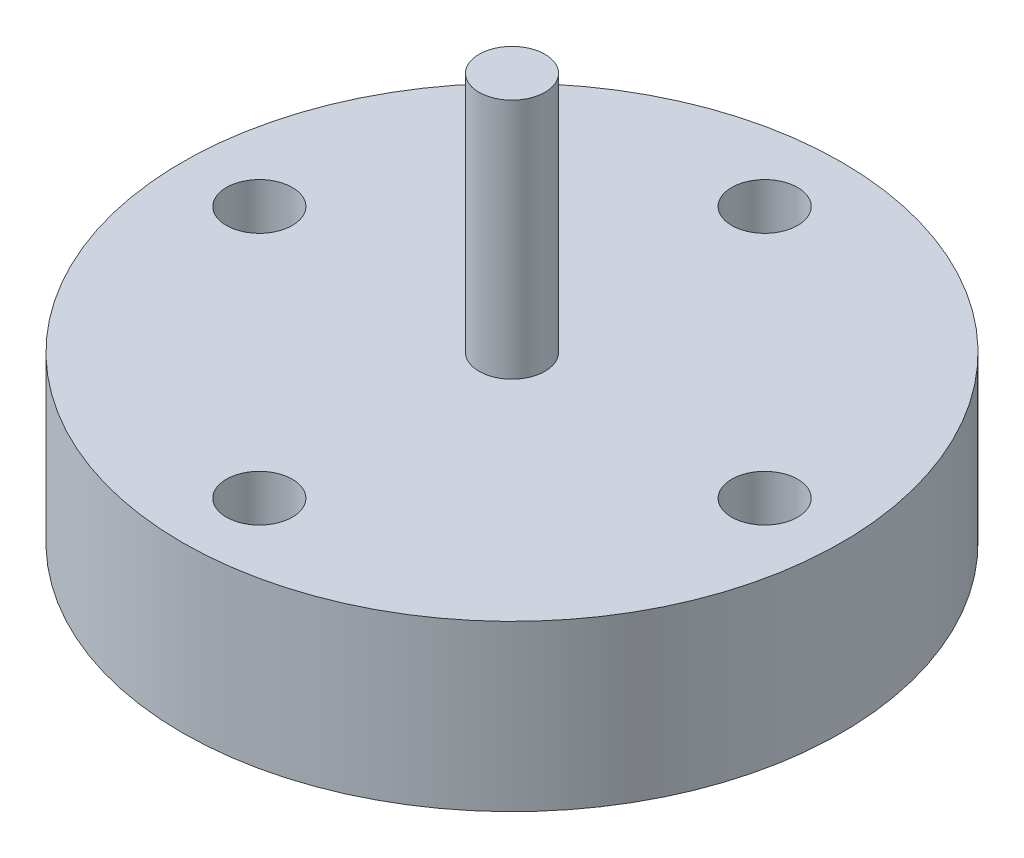
ISO-10303-21;
HEADER;
FILE_DESCRIPTION(('STEP AP214'),'2;1');
FILE_NAME('part.step','',(''),(''),'','','');
FILE_SCHEMA(('AUTOMOTIVE_DESIGN { 1 0 10303 214 1 1 1 1 }'));
ENDSEC;
DATA;
#1=APPLICATION_CONTEXT('core data for automotive mechanical design processes');
#2=APPLICATION_PROTOCOL_DEFINITION('international standard','automotive_design',2000,#1);
#3=PRODUCT_CONTEXT('',#1,'mechanical');
#4=PRODUCT('Part','Part','',(#3));
#5=PRODUCT_RELATED_PRODUCT_CATEGORY('part','',(#4));
#6=PRODUCT_DEFINITION_FORMATION('','',#4);
#7=PRODUCT_DEFINITION_CONTEXT('part definition',#1,'design');
#8=PRODUCT_DEFINITION('design','',#6,#7);
#9=PRODUCT_DEFINITION_SHAPE('','',#8);
#10=(LENGTH_UNIT() NAMED_UNIT(*) SI_UNIT(.MILLI.,.METRE.));
#11=(NAMED_UNIT(*) PLANE_ANGLE_UNIT() SI_UNIT($,.RADIAN.));
#12=(NAMED_UNIT(*) SI_UNIT($,.STERADIAN.) SOLID_ANGLE_UNIT());
#13=UNCERTAINTY_MEASURE_WITH_UNIT(LENGTH_MEASURE(1.E-05),#10,'distance_accuracy_value','');
#14=(GEOMETRIC_REPRESENTATION_CONTEXT(3) GLOBAL_UNCERTAINTY_ASSIGNED_CONTEXT((#13)) GLOBAL_UNIT_ASSIGNED_CONTEXT((#10,
#11,#12)) REPRESENTATION_CONTEXT('',''));
#15=CARTESIAN_POINT('',(0.,0.,0.));
#16=DIRECTION('',(0.,0.,1.));
#17=DIRECTION('',(1.,0.,0.));
#18=AXIS2_PLACEMENT_3D('',#15,#16,#17);
#19=CARTESIAN_POINT('',(0.,7.5,0.));
#20=DIRECTION('',(0.,-1.,0.));
#21=DIRECTION('',(0.,0.,-1.));
#22=AXIS2_PLACEMENT_3D('',#19,#20,#21);
#23=CYLINDRICAL_SURFACE('',#22,15.);
#24=CARTESIAN_POINT('',(0.,7.5,0.));
#25=DIRECTION('',(0.,1.,0.));
#26=DIRECTION('',(0.,0.,1.));
#27=AXIS2_PLACEMENT_3D('',#24,#25,#26);
#28=CIRCLE('',#27,15.);
#29=CARTESIAN_POINT('',(0.,7.5,15.));
#30=VERTEX_POINT('',#29);
#31=EDGE_CURVE('E10',#30,#30,#28,.T.);
#32=ORIENTED_EDGE('',*,*,#31,.F.);
#33=EDGE_LOOP('',(#32));
#34=FACE_BOUND('',#33,.T.);
#35=CARTESIAN_POINT('',(0.,0.,0.));
#36=DIRECTION('',(0.,1.,0.));
#37=DIRECTION('',(0.,0.,1.));
#38=AXIS2_PLACEMENT_3D('',#35,#36,#37);
#39=CIRCLE('',#38,15.);
#40=CARTESIAN_POINT('',(0.,0.,15.));
#41=VERTEX_POINT('',#40);
#42=EDGE_CURVE('E39',#41,#41,#39,.T.);
#43=ORIENTED_EDGE('',*,*,#42,.T.);
#44=EDGE_LOOP('',(#43));
#45=FACE_BOUND('',#44,.T.);
#46=ADVANCED_FACE('F36',(#34,#45),#23,.T.);
#47=CARTESIAN_POINT('',(0.,7.5,0.));
#48=DIRECTION('',(0.,1.,0.));
#49=DIRECTION('',(0.,0.,1.));
#50=AXIS2_PLACEMENT_3D('',#47,#48,#49);
#51=PLANE('',#50);
#52=CARTESIAN_POINT('',(0.,7.5,-11.5));
#53=DIRECTION('',(0.,1.,0.));
#54=DIRECTION('',(0.,0.,1.));
#55=AXIS2_PLACEMENT_3D('',#52,#53,#54);
#56=CIRCLE('',#55,1.5);
#57=CARTESIAN_POINT('',(0.,7.5,-10.));
#58=VERTEX_POINT('',#57);
#59=EDGE_CURVE('E90',#58,#58,#56,.T.);
#60=ORIENTED_EDGE('',*,*,#59,.F.);
#61=EDGE_LOOP('',(#60));
#62=FACE_BOUND('',#61,.T.);
#63=CARTESIAN_POINT('',(11.5,7.5,0.));
#64=DIRECTION('',(0.,1.,0.));
#65=DIRECTION('',(0.,0.,1.));
#66=AXIS2_PLACEMENT_3D('',#63,#64,#65);
#67=CIRCLE('',#66,1.5);
#68=CARTESIAN_POINT('',(11.5,7.5,1.5));
#69=VERTEX_POINT('',#68);
#70=EDGE_CURVE('E82',#69,#69,#67,.T.);
#71=ORIENTED_EDGE('',*,*,#70,.F.);
#72=EDGE_LOOP('',(#71));
#73=FACE_BOUND('',#72,.T.);
#74=CARTESIAN_POINT('',(0.,7.5,11.5));
#75=DIRECTION('',(0.,1.,0.));
#76=DIRECTION('',(0.,0.,1.));
#77=AXIS2_PLACEMENT_3D('',#74,#75,#76);
#78=CIRCLE('',#77,1.5);
#79=CARTESIAN_POINT('',(0.,7.5,13.));
#80=VERTEX_POINT('',#79);
#81=EDGE_CURVE('E74',#80,#80,#78,.T.);
#82=ORIENTED_EDGE('',*,*,#81,.F.);
#83=EDGE_LOOP('',(#82));
#84=FACE_BOUND('',#83,.T.);
#85=CARTESIAN_POINT('',(-11.5,7.5,0.));
#86=DIRECTION('',(0.,1.,0.));
#87=DIRECTION('',(0.,0.,1.));
#88=AXIS2_PLACEMENT_3D('',#85,#86,#87);
#89=CIRCLE('',#88,1.5);
#90=CARTESIAN_POINT('',(-11.5,7.5,1.5));
#91=VERTEX_POINT('',#90);
#92=EDGE_CURVE('E66',#91,#91,#89,.T.);
#93=ORIENTED_EDGE('',*,*,#92,.F.);
#94=EDGE_LOOP('',(#93));
#95=FACE_BOUND('',#94,.T.);
#96=CARTESIAN_POINT('',(0.,7.5,0.));
#97=DIRECTION('',(0.,1.,0.));
#98=DIRECTION('',(0.,0.,1.));
#99=AXIS2_PLACEMENT_3D('',#96,#97,#98);
#100=CIRCLE('',#99,1.5);
#101=CARTESIAN_POINT('',(0.,7.5,1.5));
#102=VERTEX_POINT('',#101);
#103=EDGE_CURVE('E50',#102,#102,#100,.T.);
#104=ORIENTED_EDGE('',*,*,#103,.F.);
#105=EDGE_LOOP('',(#104));
#106=FACE_BOUND('',#105,.T.);
#107=ORIENTED_EDGE('',*,*,#31,.T.);
#108=EDGE_LOOP('',(#107));
#109=FACE_BOUND('',#108,.T.);
#110=ADVANCED_FACE('F108',(#62,#73,#84,#95,#106,#109),#51,.T.);
#111=CARTESIAN_POINT('',(0.,0.,0.));
#112=DIRECTION('',(0.,1.,0.));
#113=DIRECTION('',(0.,0.,1.));
#114=AXIS2_PLACEMENT_3D('',#111,#112,#113);
#115=PLANE('',#114);
#116=CARTESIAN_POINT('',(0.,0.,-11.5));
#117=DIRECTION('',(0.,1.,0.));
#118=DIRECTION('',(0.,0.,1.));
#119=AXIS2_PLACEMENT_3D('',#116,#117,#118);
#120=CIRCLE('',#119,1.5);
#121=CARTESIAN_POINT('',(0.,0.,-10.));
#122=VERTEX_POINT('',#121);
#123=EDGE_CURVE('E62',#122,#122,#120,.T.);
#124=ORIENTED_EDGE('',*,*,#123,.T.);
#125=EDGE_LOOP('',(#124));
#126=FACE_BOUND('',#125,.T.);
#127=CARTESIAN_POINT('',(11.5,0.,0.));
#128=DIRECTION('',(0.,1.,0.));
#129=DIRECTION('',(0.,0.,1.));
#130=AXIS2_PLACEMENT_3D('',#127,#128,#129);
#131=CIRCLE('',#130,1.5);
#132=CARTESIAN_POINT('',(11.5,0.,1.5));
#133=VERTEX_POINT('',#132);
#134=EDGE_CURVE('E86',#133,#133,#131,.T.);
#135=ORIENTED_EDGE('',*,*,#134,.T.);
#136=EDGE_LOOP('',(#135));
#137=FACE_BOUND('',#136,.T.);
#138=CARTESIAN_POINT('',(0.,0.,11.5));
#139=DIRECTION('',(0.,1.,0.));
#140=DIRECTION('',(0.,0.,1.));
#141=AXIS2_PLACEMENT_3D('',#138,#139,#140);
#142=CIRCLE('',#141,1.5);
#143=CARTESIAN_POINT('',(0.,0.,13.));
#144=VERTEX_POINT('',#143);
#145=EDGE_CURVE('E78',#144,#144,#142,.T.);
#146=ORIENTED_EDGE('',*,*,#145,.T.);
#147=EDGE_LOOP('',(#146));
#148=FACE_BOUND('',#147,.T.);
#149=CARTESIAN_POINT('',(-11.5,0.,0.));
#150=DIRECTION('',(0.,1.,0.));
#151=DIRECTION('',(0.,0.,1.));
#152=AXIS2_PLACEMENT_3D('',#149,#150,#151);
#153=CIRCLE('',#152,1.5);
#154=CARTESIAN_POINT('',(-11.5,0.,1.5));
#155=VERTEX_POINT('',#154);
#156=EDGE_CURVE('E70',#155,#155,#153,.T.);
#157=ORIENTED_EDGE('',*,*,#156,.T.);
#158=EDGE_LOOP('',(#157));
#159=FACE_BOUND('',#158,.T.);
#160=CARTESIAN_POINT('',(0.,0.,0.));
#161=DIRECTION('',(0.,-1.,0.));
#162=DIRECTION('',(0.,0.,-1.));
#163=AXIS2_PLACEMENT_3D('',#160,#161,#162);
#164=CIRCLE('',#163,7.5);
#165=CARTESIAN_POINT('',(0.,0.,-7.5));
#166=VERTEX_POINT('',#165);
#167=EDGE_CURVE('E58',#166,#166,#164,.T.);
#168=ORIENTED_EDGE('',*,*,#167,.F.);
#169=EDGE_LOOP('',(#168));
#170=FACE_BOUND('',#169,.T.);
#171=ORIENTED_EDGE('',*,*,#42,.F.);
#172=EDGE_LOOP('',(#171));
#173=FACE_BOUND('',#172,.T.);
#174=ADVANCED_FACE('F98',(#126,#137,#148,#159,#170,#173),#115,.F.);
#175=CARTESIAN_POINT('',(0.,18.5,0.));
#176=DIRECTION('',(0.,-1.,0.));
#177=DIRECTION('',(0.,0.,-1.));
#178=AXIS2_PLACEMENT_3D('',#175,#176,#177);
#179=CYLINDRICAL_SURFACE('',#178,1.5);
#180=CARTESIAN_POINT('',(0.,18.5,0.));
#181=DIRECTION('',(0.,1.,0.));
#182=DIRECTION('',(0.,0.,1.));
#183=AXIS2_PLACEMENT_3D('',#180,#181,#182);
#184=CIRCLE('',#183,1.5);
#185=CARTESIAN_POINT('',(0.,18.5,1.5));
#186=VERTEX_POINT('',#185);
#187=EDGE_CURVE('E48',#186,#186,#184,.T.);
#188=ORIENTED_EDGE('',*,*,#187,.F.);
#189=EDGE_LOOP('',(#188));
#190=FACE_BOUND('',#189,.T.);
#191=ORIENTED_EDGE('',*,*,#103,.T.);
#192=EDGE_LOOP('',(#191));
#193=FACE_BOUND('',#192,.T.);
#194=ADVANCED_FACE('F120',(#190,#193),#179,.T.);
#195=CARTESIAN_POINT('',(0.,18.5,0.));
#196=DIRECTION('',(0.,1.,0.));
#197=DIRECTION('',(0.,0.,1.));
#198=AXIS2_PLACEMENT_3D('',#195,#196,#197);
#199=PLANE('',#198);
#200=ORIENTED_EDGE('',*,*,#187,.T.);
#201=EDGE_LOOP('',(#200));
#202=FACE_BOUND('',#201,.T.);
#203=ADVANCED_FACE('F122',(#202),#199,.T.);
#204=CARTESIAN_POINT('',(0.,3.5,0.));
#205=DIRECTION('',(0.,-1.,0.));
#206=DIRECTION('',(0.,0.,-1.));
#207=AXIS2_PLACEMENT_3D('',#204,#205,#206);
#208=CYLINDRICAL_SURFACE('',#207,7.5);
#209=CARTESIAN_POINT('',(0.,3.5,0.));
#210=DIRECTION('',(0.,-1.,0.));
#211=DIRECTION('',(0.,0.,-1.));
#212=AXIS2_PLACEMENT_3D('',#209,#210,#211);
#213=CIRCLE('',#212,7.5);
#214=CARTESIAN_POINT('',(0.,3.5,-7.5));
#215=VERTEX_POINT('',#214);
#216=EDGE_CURVE('E54',#215,#215,#213,.T.);
#217=ORIENTED_EDGE('',*,*,#216,.F.);
#218=EDGE_LOOP('',(#217));
#219=FACE_BOUND('',#218,.T.);
#220=ORIENTED_EDGE('',*,*,#167,.T.);
#221=EDGE_LOOP('',(#220));
#222=FACE_BOUND('',#221,.T.);
#223=ADVANCED_FACE('F129',(#219,#222),#208,.F.);
#224=CARTESIAN_POINT('',(0.,3.5,0.));
#225=DIRECTION('',(0.,-1.,0.));
#226=DIRECTION('',(0.,0.,-1.));
#227=AXIS2_PLACEMENT_3D('',#224,#225,#226);
#228=PLANE('',#227);
#229=ORIENTED_EDGE('',*,*,#216,.T.);
#230=EDGE_LOOP('',(#229));
#231=FACE_BOUND('',#230,.T.);
#232=ADVANCED_FACE('F163',(#231),#228,.T.);
#233=CARTESIAN_POINT('',(-11.5,0.,0.));
#234=DIRECTION('',(0.,1.,0.));
#235=DIRECTION('',(0.,0.,1.));
#236=AXIS2_PLACEMENT_3D('',#233,#234,#235);
#237=CYLINDRICAL_SURFACE('',#236,1.5);
#238=ORIENTED_EDGE('',*,*,#156,.F.);
#239=EDGE_LOOP('',(#238));
#240=FACE_BOUND('',#239,.T.);
#241=ORIENTED_EDGE('',*,*,#92,.T.);
#242=EDGE_LOOP('',(#241));
#243=FACE_BOUND('',#242,.T.);
#244=ADVANCED_FACE('F157',(#240,#243),#237,.F.);
#245=CARTESIAN_POINT('',(0.,0.,11.5));
#246=DIRECTION('',(0.,1.,0.));
#247=DIRECTION('',(0.,0.,1.));
#248=AXIS2_PLACEMENT_3D('',#245,#246,#247);
#249=CYLINDRICAL_SURFACE('',#248,1.5);
#250=ORIENTED_EDGE('',*,*,#145,.F.);
#251=EDGE_LOOP('',(#250));
#252=FACE_BOUND('',#251,.T.);
#253=ORIENTED_EDGE('',*,*,#81,.T.);
#254=EDGE_LOOP('',(#253));
#255=FACE_BOUND('',#254,.T.);
#256=ADVANCED_FACE('F162',(#252,#255),#249,.F.);
#257=CARTESIAN_POINT('',(11.5,0.,0.));
#258=DIRECTION('',(0.,1.,0.));
#259=DIRECTION('',(0.,0.,1.));
#260=AXIS2_PLACEMENT_3D('',#257,#258,#259);
#261=CYLINDRICAL_SURFACE('',#260,1.5);
#262=ORIENTED_EDGE('',*,*,#134,.F.);
#263=EDGE_LOOP('',(#262));
#264=FACE_BOUND('',#263,.T.);
#265=ORIENTED_EDGE('',*,*,#70,.T.);
#266=EDGE_LOOP('',(#265));
#267=FACE_BOUND('',#266,.T.);
#268=ADVANCED_FACE('F104',(#264,#267),#261,.F.);
#269=CARTESIAN_POINT('',(0.,0.,-11.5));
#270=DIRECTION('',(0.,1.,0.));
#271=DIRECTION('',(0.,0.,1.));
#272=AXIS2_PLACEMENT_3D('',#269,#270,#271);
#273=CYLINDRICAL_SURFACE('',#272,1.5);
#274=ORIENTED_EDGE('',*,*,#123,.F.);
#275=EDGE_LOOP('',(#274));
#276=FACE_BOUND('',#275,.T.);
#277=ORIENTED_EDGE('',*,*,#59,.T.);
#278=EDGE_LOOP('',(#277));
#279=FACE_BOUND('',#278,.T.);
#280=ADVANCED_FACE('F101',(#276,#279),#273,.F.);
#281=CLOSED_SHELL('',(#46,#110,#174,#194,#203,#223,#232,#244,#256,#268,#280));
#282=MANIFOLD_SOLID_BREP('B2',#281);
#283=ADVANCED_BREP_SHAPE_REPRESENTATION('',(#18,#282),#14);
#284=SHAPE_DEFINITION_REPRESENTATION(#9,#283);
ENDSEC;
END-ISO-10303-21;
